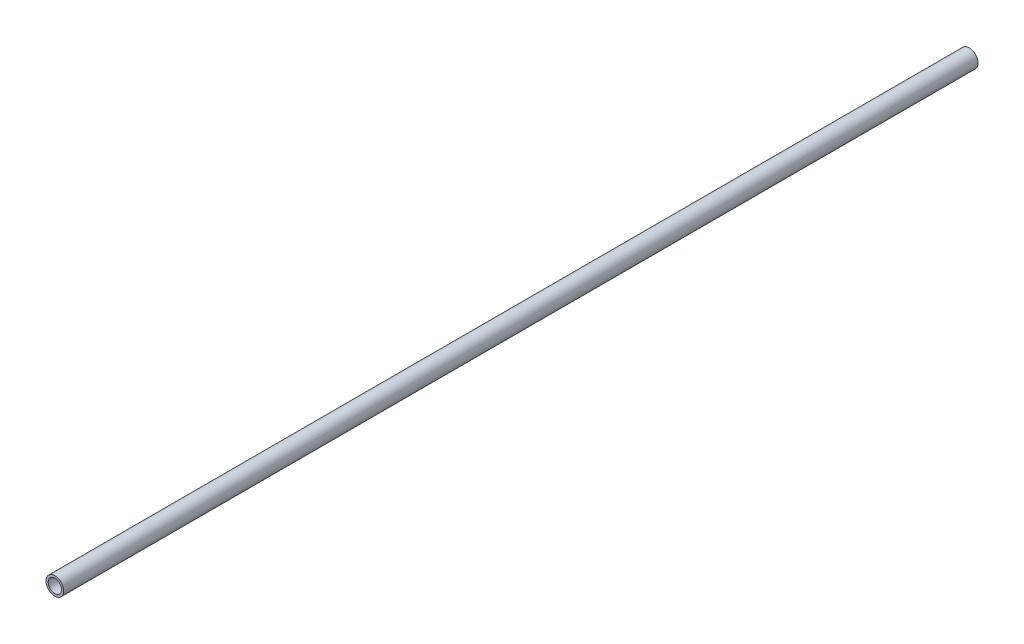
ISO-10303-21;
HEADER;
FILE_DESCRIPTION(('STEP AP214'),'2;1');
FILE_NAME('part.step','',(''),(''),'','','');
FILE_SCHEMA(('AUTOMOTIVE_DESIGN { 1 0 10303 214 1 1 1 1 }'));
ENDSEC;
DATA;
#1=APPLICATION_CONTEXT('core data for automotive mechanical design processes');
#2=APPLICATION_PROTOCOL_DEFINITION('international standard','automotive_design',2000,#1);
#3=PRODUCT_CONTEXT('',#1,'mechanical');
#4=PRODUCT('Part','Part','',(#3));
#5=PRODUCT_RELATED_PRODUCT_CATEGORY('part','',(#4));
#6=PRODUCT_DEFINITION_FORMATION('','',#4);
#7=PRODUCT_DEFINITION_CONTEXT('part definition',#1,'design');
#8=PRODUCT_DEFINITION('design','',#6,#7);
#9=PRODUCT_DEFINITION_SHAPE('','',#8);
#10=(LENGTH_UNIT() NAMED_UNIT(*) SI_UNIT(.MILLI.,.METRE.));
#11=(NAMED_UNIT(*) PLANE_ANGLE_UNIT() SI_UNIT($,.RADIAN.));
#12=(NAMED_UNIT(*) SI_UNIT($,.STERADIAN.) SOLID_ANGLE_UNIT());
#13=UNCERTAINTY_MEASURE_WITH_UNIT(LENGTH_MEASURE(1.E-05),#10,'distance_accuracy_value','');
#14=(GEOMETRIC_REPRESENTATION_CONTEXT(3) GLOBAL_UNCERTAINTY_ASSIGNED_CONTEXT((#13)) GLOBAL_UNIT_ASSIGNED_CONTEXT((#10,
#11,#12)) REPRESENTATION_CONTEXT('',''));
#15=CARTESIAN_POINT('',(0.,0.,0.));
#16=DIRECTION('',(0.,0.,1.));
#17=DIRECTION('',(1.,0.,0.));
#18=AXIS2_PLACEMENT_3D('',#15,#16,#17);
#19=CARTESIAN_POINT('',(0.,0.,206.375));
#20=DIRECTION('',(0.,0.,1.));
#21=DIRECTION('',(1.,0.,0.));
#22=AXIS2_PLACEMENT_3D('',#19,#20,#21);
#23=PLANE('',#22);
#24=CARTESIAN_POINT('',(0.,0.,206.375));
#25=DIRECTION('',(0.,0.,1.));
#26=DIRECTION('',(1.,0.,0.));
#27=AXIS2_PLACEMENT_3D('',#24,#25,#26);
#28=CIRCLE('',#27,2.);
#29=CARTESIAN_POINT('',(2.,0.,206.375));
#30=VERTEX_POINT('',#29);
#31=EDGE_CURVE('E10',#30,#30,#28,.T.);
#32=ORIENTED_EDGE('',*,*,#31,.T.);
#33=EDGE_LOOP('',(#32));
#34=FACE_BOUND('',#33,.T.);
#35=CARTESIAN_POINT('',(0.,0.,206.375));
#36=DIRECTION('',(0.,0.,1.));
#37=DIRECTION('',(1.,0.,0.));
#38=AXIS2_PLACEMENT_3D('',#35,#36,#37);
#39=CIRCLE('',#38,1.5);
#40=CARTESIAN_POINT('',(1.5,0.,206.375));
#41=VERTEX_POINT('',#40);
#42=EDGE_CURVE('E50',#41,#41,#39,.T.);
#43=ORIENTED_EDGE('',*,*,#42,.F.);
#44=EDGE_LOOP('',(#43));
#45=FACE_BOUND('',#44,.T.);
#46=ADVANCED_FACE('F37',(#34,#45),#23,.T.);
#47=CARTESIAN_POINT('',(0.,0.,0.));
#48=DIRECTION('',(0.,0.,1.));
#49=DIRECTION('',(1.,0.,0.));
#50=AXIS2_PLACEMENT_3D('',#47,#48,#49);
#51=PLANE('',#50);
#52=CARTESIAN_POINT('',(0.,0.,0.));
#53=DIRECTION('',(0.,0.,1.));
#54=DIRECTION('',(1.,0.,0.));
#55=AXIS2_PLACEMENT_3D('',#52,#53,#54);
#56=CIRCLE('',#55,2.);
#57=CARTESIAN_POINT('',(2.,0.,0.));
#58=VERTEX_POINT('',#57);
#59=EDGE_CURVE('E41',#58,#58,#56,.T.);
#60=ORIENTED_EDGE('',*,*,#59,.F.);
#61=EDGE_LOOP('',(#60));
#62=FACE_BOUND('',#61,.T.);
#63=CARTESIAN_POINT('',(0.,0.,0.));
#64=DIRECTION('',(0.,0.,1.));
#65=DIRECTION('',(1.,0.,0.));
#66=AXIS2_PLACEMENT_3D('',#63,#64,#65);
#67=CIRCLE('',#66,1.5);
#68=CARTESIAN_POINT('',(1.5,0.,0.));
#69=VERTEX_POINT('',#68);
#70=EDGE_CURVE('E52',#69,#69,#67,.T.);
#71=ORIENTED_EDGE('',*,*,#70,.T.);
#72=EDGE_LOOP('',(#71));
#73=FACE_BOUND('',#72,.T.);
#74=ADVANCED_FACE('F64',(#62,#73),#51,.F.);
#75=CARTESIAN_POINT('',(0.,0.,206.375));
#76=DIRECTION('',(0.,0.,-1.));
#77=DIRECTION('',(-1.,0.,0.));
#78=AXIS2_PLACEMENT_3D('',#75,#76,#77);
#79=CYLINDRICAL_SURFACE('',#78,2.);
#80=ORIENTED_EDGE('',*,*,#31,.F.);
#81=EDGE_LOOP('',(#80));
#82=FACE_BOUND('',#81,.T.);
#83=ORIENTED_EDGE('',*,*,#59,.T.);
#84=EDGE_LOOP('',(#83));
#85=FACE_BOUND('',#84,.T.);
#86=ADVANCED_FACE('F39',(#82,#85),#79,.T.);
#87=CARTESIAN_POINT('',(0.,0.,206.375));
#88=DIRECTION('',(0.,0.,-1.));
#89=DIRECTION('',(-1.,0.,0.));
#90=AXIS2_PLACEMENT_3D('',#87,#88,#89);
#91=CYLINDRICAL_SURFACE('',#90,1.5);
#92=ORIENTED_EDGE('',*,*,#42,.T.);
#93=EDGE_LOOP('',(#92));
#94=FACE_BOUND('',#93,.T.);
#95=ORIENTED_EDGE('',*,*,#70,.F.);
#96=EDGE_LOOP('',(#95));
#97=FACE_BOUND('',#96,.T.);
#98=ADVANCED_FACE('F60',(#94,#97),#91,.F.);
#99=CLOSED_SHELL('',(#46,#74,#86,#98));
#100=MANIFOLD_SOLID_BREP('B2',#99);
#101=ADVANCED_BREP_SHAPE_REPRESENTATION('',(#18,#100),#14);
#102=SHAPE_DEFINITION_REPRESENTATION(#9,#101);
ENDSEC;
END-ISO-10303-21;
